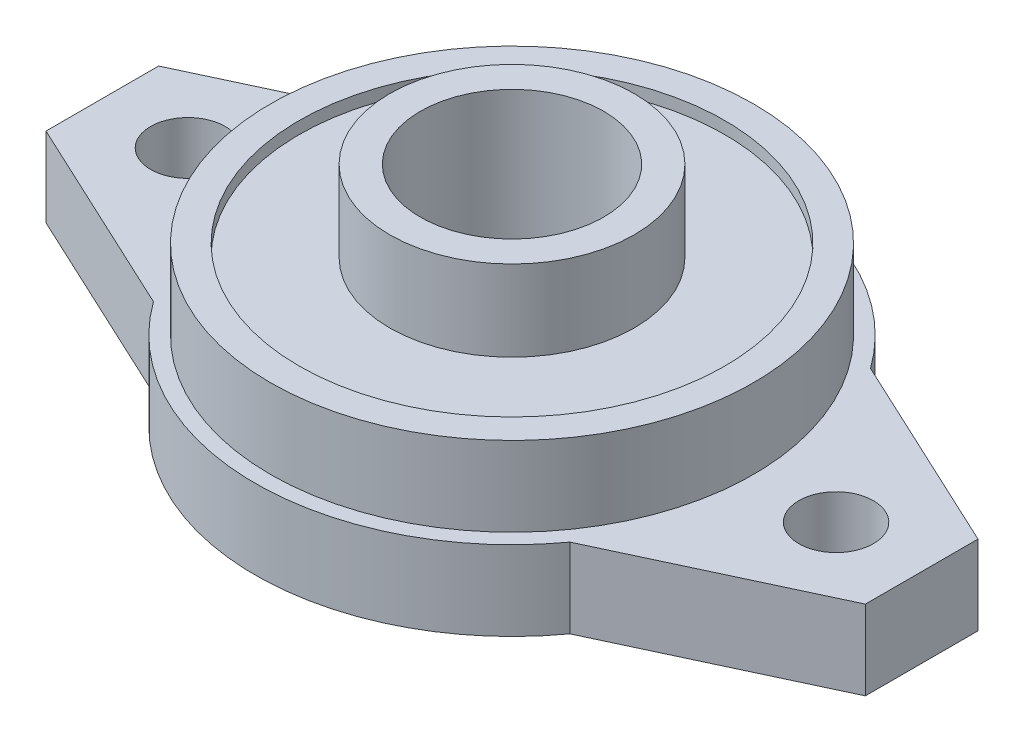
ISO-10303-21;
HEADER;
FILE_DESCRIPTION(('STEP AP214'),'2;1');
FILE_NAME('part.step','',(''),(''),'','','');
FILE_SCHEMA(('AUTOMOTIVE_DESIGN { 1 0 10303 214 1 1 1 1 }'));
ENDSEC;
DATA;
#1=APPLICATION_CONTEXT('core data for automotive mechanical design processes');
#2=APPLICATION_PROTOCOL_DEFINITION('international standard','automotive_design',2000,#1);
#3=PRODUCT_CONTEXT('',#1,'mechanical');
#4=PRODUCT('Part','Part','',(#3));
#5=PRODUCT_RELATED_PRODUCT_CATEGORY('part','',(#4));
#6=PRODUCT_DEFINITION_FORMATION('','',#4);
#7=PRODUCT_DEFINITION_CONTEXT('part definition',#1,'design');
#8=PRODUCT_DEFINITION('design','',#6,#7);
#9=PRODUCT_DEFINITION_SHAPE('','',#8);
#10=(LENGTH_UNIT() NAMED_UNIT(*) SI_UNIT(.MILLI.,.METRE.));
#11=(NAMED_UNIT(*) PLANE_ANGLE_UNIT() SI_UNIT($,.RADIAN.));
#12=(NAMED_UNIT(*) SI_UNIT($,.STERADIAN.) SOLID_ANGLE_UNIT());
#13=UNCERTAINTY_MEASURE_WITH_UNIT(LENGTH_MEASURE(1.E-05),#10,'distance_accuracy_value','');
#14=(GEOMETRIC_REPRESENTATION_CONTEXT(3) GLOBAL_UNCERTAINTY_ASSIGNED_CONTEXT((#13)) GLOBAL_UNIT_ASSIGNED_CONTEXT((#10,
#11,#12)) REPRESENTATION_CONTEXT('',''));
#15=CARTESIAN_POINT('',(0.,0.,0.));
#16=DIRECTION('',(0.,0.,1.));
#17=DIRECTION('',(1.,0.,0.));
#18=AXIS2_PLACEMENT_3D('',#15,#16,#17);
#19=CARTESIAN_POINT('',(0.,13.,0.));
#20=DIRECTION('',(0.,1.,0.));
#21=DIRECTION('',(0.,0.,1.));
#22=AXIS2_PLACEMENT_3D('',#19,#20,#21);
#23=PLANE('',#22);
#24=CARTESIAN_POINT('',(0.,13.,0.));
#25=DIRECTION('',(0.,1.,0.));
#26=DIRECTION('',(0.,0.,1.));
#27=AXIS2_PLACEMENT_3D('',#24,#25,#26);
#28=CIRCLE('',#27,17.4);
#29=CARTESIAN_POINT('',(0.,13.,17.4));
#30=VERTEX_POINT('',#29);
#31=EDGE_CURVE('E209',#30,#30,#28,.T.);
#32=ORIENTED_EDGE('',*,*,#31,.F.);
#33=EDGE_LOOP('',(#32));
#34=FACE_BOUND('',#33,.T.);
#35=CARTESIAN_POINT('',(0.,13.,0.));
#36=DIRECTION('',(0.,1.,0.));
#37=DIRECTION('',(0.,0.,1.));
#38=AXIS2_PLACEMENT_3D('',#35,#36,#37);
#39=CIRCLE('',#38,19.75);
#40=CARTESIAN_POINT('',(0.,13.,-19.75));
#41=VERTEX_POINT('',#40);
#42=EDGE_CURVE('E143',#41,#41,#39,.T.);
#43=ORIENTED_EDGE('',*,*,#42,.T.);
#44=EDGE_LOOP('',(#43));
#45=FACE_BOUND('',#44,.T.);
#46=ADVANCED_FACE('F37',(#34,#45),#23,.T.);
#47=CARTESIAN_POINT('',(0.,6.5,0.));
#48=DIRECTION('',(0.,1.,0.));
#49=DIRECTION('',(0.,0.,1.));
#50=AXIS2_PLACEMENT_3D('',#47,#48,#49);
#51=PLANE('',#50);
#52=CARTESIAN_POINT('',(26.5,6.5,0.));
#53=DIRECTION('',(0.,1.,0.));
#54=DIRECTION('',(0.,0.,1.));
#55=AXIS2_PLACEMENT_3D('',#52,#53,#54);
#56=CIRCLE('',#55,3.05);
#57=CARTESIAN_POINT('',(26.5,6.5,-3.05));
#58=VERTEX_POINT('',#57);
#59=EDGE_CURVE('E131',#58,#58,#56,.F.);
#60=ORIENTED_EDGE('',*,*,#59,.T.);
#61=EDGE_LOOP('',(#60));
#62=FACE_BOUND('',#61,.T.);
#63=DIRECTION('',(0.906176690026417,0.,0.422899286417898));
#64=VECTOR('',#63,1.);
#65=CARTESIAN_POINT('',(-7.75598540368265,6.5,16.6193072599729));
#66=LINE('',#65,#64);
#67=CARTESIAN_POINT('',(-33.5,6.5,4.60495561956913));
#68=VERTEX_POINT('',#67);
#69=CARTESIAN_POINT('',(-17.025748483338,6.5,12.2932456488153));
#70=VERTEX_POINT('',#69);
#71=EDGE_CURVE('E192',#68,#70,#66,.T.);
#72=ORIENTED_EDGE('',*,*,#71,.T.);
#73=CARTESIAN_POINT('',(0.,6.5,0.));
#74=DIRECTION('',(0.,1.,0.));
#75=DIRECTION('',(0.,0.,1.));
#76=AXIS2_PLACEMENT_3D('',#73,#74,#75);
#77=CIRCLE('',#76,21.);
#78=CARTESIAN_POINT('',(17.025748483338,6.5,12.2932456488153));
#79=VERTEX_POINT('',#78);
#80=EDGE_CURVE('E93',#70,#79,#77,.T.);
#81=ORIENTED_EDGE('',*,*,#80,.T.);
#82=DIRECTION('',(-0.906176690026417,0.,0.422899286417898));
#83=VECTOR('',#82,1.);
#84=CARTESIAN_POINT('',(7.75598540368265,6.5,16.6193072599729));
#85=LINE('',#84,#83);
#86=CARTESIAN_POINT('',(33.5,6.5,4.60495561956913));
#87=VERTEX_POINT('',#86);
#88=EDGE_CURVE('E178',#87,#79,#85,.T.);
#89=ORIENTED_EDGE('',*,*,#88,.F.);
#90=DIRECTION('',(0.,0.,1.));
#91=VECTOR('',#90,1.);
#92=CARTESIAN_POINT('',(33.5,6.5,0.));
#93=LINE('',#92,#91);
#94=CARTESIAN_POINT('',(33.5,6.5,-4.60495561956913));
#95=VERTEX_POINT('',#94);
#96=EDGE_CURVE('E190',#95,#87,#93,.T.);
#97=ORIENTED_EDGE('',*,*,#96,.F.);
#98=DIRECTION('',(-0.906176690026417,0.,-0.422899286417899));
#99=VECTOR('',#98,1.);
#100=CARTESIAN_POINT('',(7.75598540368266,6.5,-16.6193072599729));
#101=LINE('',#100,#99);
#102=CARTESIAN_POINT('',(17.025748483338,6.5,-12.2932456488153));
#103=VERTEX_POINT('',#102);
#104=EDGE_CURVE('E114',#95,#103,#101,.T.);
#105=ORIENTED_EDGE('',*,*,#104,.T.);
#106=CARTESIAN_POINT('',(-17.025748483338,6.5,-12.2932456488153));
#107=VERTEX_POINT('',#106);
#108=EDGE_CURVE('E106',#103,#107,#77,.T.);
#109=ORIENTED_EDGE('',*,*,#108,.T.);
#110=DIRECTION('',(0.906176690026417,0.,-0.422899286417899));
#111=VECTOR('',#110,1.);
#112=CARTESIAN_POINT('',(-7.75598540368266,6.5,-16.6193072599729));
#113=LINE('',#112,#111);
#114=CARTESIAN_POINT('',(-33.5,6.5,-4.60495561956913));
#115=VERTEX_POINT('',#114);
#116=EDGE_CURVE('E111',#115,#107,#113,.T.);
#117=ORIENTED_EDGE('',*,*,#116,.F.);
#118=DIRECTION('',(0.,0.,1.));
#119=VECTOR('',#118,1.);
#120=CARTESIAN_POINT('',(-33.5,6.5,0.));
#121=LINE('',#120,#119);
#122=EDGE_CURVE('E54',#115,#68,#121,.T.);
#123=ORIENTED_EDGE('',*,*,#122,.T.);
#124=EDGE_LOOP('',(#72,#81,#89,#97,#105,#109,#117,#123));
#125=FACE_BOUND('',#124,.T.);
#126=CARTESIAN_POINT('',(-26.5,6.5,0.));
#127=DIRECTION('',(0.,1.,0.));
#128=DIRECTION('',(0.,0.,1.));
#129=AXIS2_PLACEMENT_3D('',#126,#127,#128);
#130=CIRCLE('',#129,3.05);
#131=CARTESIAN_POINT('',(-26.5,6.5,-3.05));
#132=VERTEX_POINT('',#131);
#133=EDGE_CURVE('E166',#132,#132,#130,.T.);
#134=ORIENTED_EDGE('',*,*,#133,.F.);
#135=EDGE_LOOP('',(#134));
#136=FACE_BOUND('',#135,.T.);
#137=CARTESIAN_POINT('',(0.,6.5,0.));
#138=DIRECTION('',(0.,1.,0.));
#139=DIRECTION('',(0.,0.,1.));
#140=AXIS2_PLACEMENT_3D('',#137,#138,#139);
#141=CIRCLE('',#140,19.75);
#142=CARTESIAN_POINT('',(0.,6.5,-19.75));
#143=VERTEX_POINT('',#142);
#144=EDGE_CURVE('E197',#143,#143,#141,.T.);
#145=ORIENTED_EDGE('',*,*,#144,.F.);
#146=EDGE_LOOP('',(#145));
#147=FACE_BOUND('',#146,.T.);
#148=ADVANCED_FACE('F108',(#62,#125,#136,#147),#51,.T.);
#149=CARTESIAN_POINT('',(-7.75598540368265,6.5,16.6193072599729));
#150=DIRECTION('',(0.422899286417898,0.,-0.906176690026417));
#151=DIRECTION('',(-0.906176690026417,0.,-0.422899286417898));
#152=AXIS2_PLACEMENT_3D('',#149,#150,#151);
#153=PLANE('',#152);
#154=DIRECTION('',(0.906176690026417,0.,0.422899286417898));
#155=VECTOR('',#154,1.);
#156=CARTESIAN_POINT('',(-7.75598540368265,0.,16.6193072599729));
#157=LINE('',#156,#155);
#158=CARTESIAN_POINT('',(-33.5,0.,4.60495561956913));
#159=VERTEX_POINT('',#158);
#160=CARTESIAN_POINT('',(-17.025748483338,0.,12.2932456488153));
#161=VERTEX_POINT('',#160);
#162=EDGE_CURVE('E142',#159,#161,#157,.T.);
#163=ORIENTED_EDGE('',*,*,#162,.T.);
#164=DIRECTION('',(0.,-1.,0.));
#165=VECTOR('',#164,1.);
#166=CARTESIAN_POINT('',(-17.025748483338,6.5,12.2932456488153));
#167=LINE('',#166,#165);
#168=EDGE_CURVE('E11',#70,#161,#167,.T.);
#169=ORIENTED_EDGE('',*,*,#168,.F.);
#170=ORIENTED_EDGE('',*,*,#71,.F.);
#171=DIRECTION('',(0.,-1.,0.));
#172=VECTOR('',#171,1.);
#173=CARTESIAN_POINT('',(-33.5,6.5,4.60495561956913));
#174=LINE('',#173,#172);
#175=EDGE_CURVE('E138',#68,#159,#174,.T.);
#176=ORIENTED_EDGE('',*,*,#175,.T.);
#177=EDGE_LOOP('',(#163,#169,#170,#176));
#178=FACE_BOUND('',#177,.T.);
#179=ADVANCED_FACE('F245',(#178),#153,.F.);
#180=CARTESIAN_POINT('',(0.,6.5,0.));
#181=DIRECTION('',(0.,-1.,0.));
#182=DIRECTION('',(0.,0.,-1.));
#183=AXIS2_PLACEMENT_3D('',#180,#181,#182);
#184=CYLINDRICAL_SURFACE('',#183,21.);
#185=CARTESIAN_POINT('',(0.,0.,0.));
#186=DIRECTION('',(0.,1.,0.));
#187=DIRECTION('',(0.,0.,1.));
#188=AXIS2_PLACEMENT_3D('',#185,#186,#187);
#189=CIRCLE('',#188,21.);
#190=CARTESIAN_POINT('',(17.025748483338,0.,12.2932456488153));
#191=VERTEX_POINT('',#190);
#192=EDGE_CURVE('E146',#161,#191,#189,.T.);
#193=ORIENTED_EDGE('',*,*,#192,.T.);
#194=DIRECTION('',(0.,-1.,0.));
#195=VECTOR('',#194,1.);
#196=CARTESIAN_POINT('',(17.025748483338,6.5,12.2932456488153));
#197=LINE('',#196,#195);
#198=EDGE_CURVE('E46',#79,#191,#197,.T.);
#199=ORIENTED_EDGE('',*,*,#198,.F.);
#200=ORIENTED_EDGE('',*,*,#80,.F.);
#201=ORIENTED_EDGE('',*,*,#168,.T.);
#202=EDGE_LOOP('',(#193,#199,#200,#201));
#203=FACE_BOUND('',#202,.T.);
#204=ADVANCED_FACE('F179',(#203),#184,.T.);
#205=CARTESIAN_POINT('',(7.75598540368265,6.5,16.6193072599729));
#206=DIRECTION('',(0.422899286417898,0.,0.906176690026417));
#207=DIRECTION('',(0.906176690026417,0.,-0.422899286417898));
#208=AXIS2_PLACEMENT_3D('',#205,#206,#207);
#209=PLANE('',#208);
#210=DIRECTION('',(-0.906176690026417,0.,0.422899286417898));
#211=VECTOR('',#210,1.);
#212=CARTESIAN_POINT('',(7.75598540368265,0.,16.6193072599729));
#213=LINE('',#212,#211);
#214=CARTESIAN_POINT('',(33.5,0.,4.60495561956913));
#215=VERTEX_POINT('',#214);
#216=EDGE_CURVE('E149',#215,#191,#213,.T.);
#217=ORIENTED_EDGE('',*,*,#216,.F.);
#218=DIRECTION('',(0.,-1.,0.));
#219=VECTOR('',#218,1.);
#220=CARTESIAN_POINT('',(33.5,6.5,4.60495561956913));
#221=LINE('',#220,#219);
#222=EDGE_CURVE('E172',#87,#215,#221,.T.);
#223=ORIENTED_EDGE('',*,*,#222,.F.);
#224=ORIENTED_EDGE('',*,*,#88,.T.);
#225=ORIENTED_EDGE('',*,*,#198,.T.);
#226=EDGE_LOOP('',(#217,#223,#224,#225));
#227=FACE_BOUND('',#226,.T.);
#228=ADVANCED_FACE('F176',(#227),#209,.T.);
#229=CARTESIAN_POINT('',(33.5,6.5,0.));
#230=DIRECTION('',(1.,0.,0.));
#231=DIRECTION('',(0.,0.,-1.));
#232=AXIS2_PLACEMENT_3D('',#229,#230,#231);
#233=PLANE('',#232);
#234=DIRECTION('',(0.,0.,1.));
#235=VECTOR('',#234,1.);
#236=CARTESIAN_POINT('',(33.5,0.,0.));
#237=LINE('',#236,#235);
#238=CARTESIAN_POINT('',(33.5,0.,-4.60495561956913));
#239=VERTEX_POINT('',#238);
#240=EDGE_CURVE('E152',#239,#215,#237,.T.);
#241=ORIENTED_EDGE('',*,*,#240,.F.);
#242=DIRECTION('',(0.,-1.,0.));
#243=VECTOR('',#242,1.);
#244=CARTESIAN_POINT('',(33.5,6.5,-4.60495561956913));
#245=LINE('',#244,#243);
#246=EDGE_CURVE('E170',#95,#239,#245,.T.);
#247=ORIENTED_EDGE('',*,*,#246,.F.);
#248=ORIENTED_EDGE('',*,*,#96,.T.);
#249=ORIENTED_EDGE('',*,*,#222,.T.);
#250=EDGE_LOOP('',(#241,#247,#248,#249));
#251=FACE_BOUND('',#250,.T.);
#252=ADVANCED_FACE('F188',(#251),#233,.T.);
#253=CARTESIAN_POINT('',(7.75598540368266,6.5,-16.6193072599729));
#254=DIRECTION('',(-0.422899286417899,0.,0.906176690026417));
#255=DIRECTION('',(0.906176690026417,0.,0.422899286417899));
#256=AXIS2_PLACEMENT_3D('',#253,#254,#255);
#257=PLANE('',#256);
#258=DIRECTION('',(-0.906176690026417,0.,-0.422899286417899));
#259=VECTOR('',#258,1.);
#260=CARTESIAN_POINT('',(7.75598540368266,0.,-16.6193072599729));
#261=LINE('',#260,#259);
#262=CARTESIAN_POINT('',(17.025748483338,0.,-12.2932456488153));
#263=VERTEX_POINT('',#262);
#264=EDGE_CURVE('E155',#239,#263,#261,.T.);
#265=ORIENTED_EDGE('',*,*,#264,.T.);
#266=DIRECTION('',(0.,-1.,0.));
#267=VECTOR('',#266,1.);
#268=CARTESIAN_POINT('',(17.025748483338,6.5,-12.2932456488153));
#269=LINE('',#268,#267);
#270=EDGE_CURVE('E127',#103,#263,#269,.T.);
#271=ORIENTED_EDGE('',*,*,#270,.F.);
#272=ORIENTED_EDGE('',*,*,#104,.F.);
#273=ORIENTED_EDGE('',*,*,#246,.T.);
#274=EDGE_LOOP('',(#265,#271,#272,#273));
#275=FACE_BOUND('',#274,.T.);
#276=ADVANCED_FACE('F271',(#275),#257,.F.);
#277=CARTESIAN_POINT('',(-17.025748483338,0.,-12.2932456488153));
#278=VERTEX_POINT('',#277);
#279=EDGE_CURVE('E123',#263,#278,#189,.T.);
#280=ORIENTED_EDGE('',*,*,#279,.T.);
#281=DIRECTION('',(0.,-1.,0.));
#282=VECTOR('',#281,1.);
#283=CARTESIAN_POINT('',(-17.025748483338,6.5,-12.2932456488153));
#284=LINE('',#283,#282);
#285=EDGE_CURVE('E120',#107,#278,#284,.T.);
#286=ORIENTED_EDGE('',*,*,#285,.F.);
#287=ORIENTED_EDGE('',*,*,#108,.F.);
#288=ORIENTED_EDGE('',*,*,#270,.T.);
#289=EDGE_LOOP('',(#280,#286,#287,#288));
#290=FACE_BOUND('',#289,.T.);
#291=ADVANCED_FACE('F121',(#290),#184,.T.);
#292=CARTESIAN_POINT('',(-7.75598540368266,6.5,-16.6193072599729));
#293=DIRECTION('',(-0.422899286417899,0.,-0.906176690026417));
#294=DIRECTION('',(-0.906176690026417,0.,0.422899286417899));
#295=AXIS2_PLACEMENT_3D('',#292,#293,#294);
#296=PLANE('',#295);
#297=DIRECTION('',(0.906176690026417,0.,-0.422899286417899));
#298=VECTOR('',#297,1.);
#299=CARTESIAN_POINT('',(-7.75598540368266,0.,-16.6193072599729));
#300=LINE('',#299,#298);
#301=CARTESIAN_POINT('',(-33.5,0.,-4.60495561956913));
#302=VERTEX_POINT('',#301);
#303=EDGE_CURVE('E157',#302,#278,#300,.T.);
#304=ORIENTED_EDGE('',*,*,#303,.F.);
#305=DIRECTION('',(0.,-1.,0.));
#306=VECTOR('',#305,1.);
#307=CARTESIAN_POINT('',(-33.5,6.5,-4.60495561956913));
#308=LINE('',#307,#306);
#309=EDGE_CURVE('E82',#115,#302,#308,.T.);
#310=ORIENTED_EDGE('',*,*,#309,.F.);
#311=ORIENTED_EDGE('',*,*,#116,.T.);
#312=ORIENTED_EDGE('',*,*,#285,.T.);
#313=EDGE_LOOP('',(#304,#310,#311,#312));
#314=FACE_BOUND('',#313,.T.);
#315=ADVANCED_FACE('F129',(#314),#296,.T.);
#316=CARTESIAN_POINT('',(0.,6.5,0.));
#317=DIRECTION('',(0.,-1.,0.));
#318=DIRECTION('',(0.,0.,-1.));
#319=AXIS2_PLACEMENT_3D('',#316,#317,#318);
#320=CYLINDRICAL_SURFACE('',#319,7.5);
#321=CARTESIAN_POINT('',(0.,0.,0.));
#322=DIRECTION('',(0.,1.,0.));
#323=DIRECTION('',(0.,0.,1.));
#324=AXIS2_PLACEMENT_3D('',#321,#322,#323);
#325=CIRCLE('',#324,7.5);
#326=CARTESIAN_POINT('',(0.,0.,-7.5));
#327=VERTEX_POINT('',#326);
#328=EDGE_CURVE('E160',#327,#327,#325,.T.);
#329=CARTESIAN_POINT('',(0.,18.6,0.));
#330=DIRECTION('',(0.,1.,0.));
#331=DIRECTION('',(0.,0.,1.));
#332=AXIS2_PLACEMENT_3D('',#329,#330,#331);
#333=CIRCLE('',#332,7.5);
#334=CARTESIAN_POINT('',(0.,18.6,-7.5));
#335=VERTEX_POINT('',#334);
#336=EDGE_CURVE('E205',#335,#335,#333,.T.);
#337=CARTESIAN_POINT('',(0.,0.,-7.5));
#338=CARTESIAN_POINT('',(0.,0.19375,-7.5));
#339=CARTESIAN_POINT('',(0.,0.3875,-7.5));
#340=CARTESIAN_POINT('',(0.,0.775,-7.5));
#341=CARTESIAN_POINT('',(0.,0.96875,-7.5));
#342=CARTESIAN_POINT('',(0.,1.35625,-7.5));
#343=CARTESIAN_POINT('',(0.,1.55,-7.5));
#344=CARTESIAN_POINT('',(0.,1.9375,-7.5));
#345=CARTESIAN_POINT('',(0.,2.13125,-7.5));
#346=CARTESIAN_POINT('',(0.,2.51875,-7.5));
#347=CARTESIAN_POINT('',(0.,2.7125,-7.5));
#348=CARTESIAN_POINT('',(0.,3.1,-7.5));
#349=CARTESIAN_POINT('',(0.,3.29375,-7.5));
#350=CARTESIAN_POINT('',(0.,3.68125,-7.5));
#351=CARTESIAN_POINT('',(0.,3.875,-7.5));
#352=CARTESIAN_POINT('',(0.,4.2625,-7.5));
#353=CARTESIAN_POINT('',(0.,4.45625,-7.5));
#354=CARTESIAN_POINT('',(0.,4.84375,-7.5));
#355=CARTESIAN_POINT('',(0.,5.0375,-7.5));
#356=CARTESIAN_POINT('',(0.,5.425,-7.5));
#357=CARTESIAN_POINT('',(0.,5.61875,-7.5));
#358=CARTESIAN_POINT('',(0.,6.00625,-7.5));
#359=CARTESIAN_POINT('',(0.,6.2,-7.5));
#360=CARTESIAN_POINT('',(0.,6.5875,-7.5));
#361=CARTESIAN_POINT('',(0.,6.78125,-7.5));
#362=CARTESIAN_POINT('',(0.,7.16875,-7.5));
#363=CARTESIAN_POINT('',(0.,7.3625,-7.5));
#364=CARTESIAN_POINT('',(0.,7.75,-7.5));
#365=CARTESIAN_POINT('',(0.,7.94375,-7.5));
#366=CARTESIAN_POINT('',(0.,8.33125,-7.5));
#367=CARTESIAN_POINT('',(0.,8.525,-7.5));
#368=CARTESIAN_POINT('',(0.,8.9125,-7.5));
#369=CARTESIAN_POINT('',(0.,9.10625,-7.5));
#370=CARTESIAN_POINT('',(0.,9.49375,-7.5));
#371=CARTESIAN_POINT('',(0.,9.6875,-7.5));
#372=CARTESIAN_POINT('',(0.,10.075,-7.5));
#373=CARTESIAN_POINT('',(0.,10.26875,-7.5));
#374=CARTESIAN_POINT('',(0.,10.65625,-7.5));
#375=CARTESIAN_POINT('',(0.,10.85,-7.5));
#376=CARTESIAN_POINT('',(0.,11.2375,-7.5));
#377=CARTESIAN_POINT('',(0.,11.43125,-7.5));
#378=CARTESIAN_POINT('',(0.,11.81875,-7.5));
#379=CARTESIAN_POINT('',(0.,12.0125,-7.5));
#380=CARTESIAN_POINT('',(0.,12.4,-7.5));
#381=CARTESIAN_POINT('',(0.,12.59375,-7.5));
#382=CARTESIAN_POINT('',(0.,12.98125,-7.5));
#383=CARTESIAN_POINT('',(0.,13.175,-7.5));
#384=CARTESIAN_POINT('',(0.,13.5625,-7.5));
#385=CARTESIAN_POINT('',(0.,13.75625,-7.5));
#386=CARTESIAN_POINT('',(0.,14.14375,-7.5));
#387=CARTESIAN_POINT('',(0.,14.3375,-7.5));
#388=CARTESIAN_POINT('',(0.,14.725,-7.5));
#389=CARTESIAN_POINT('',(0.,14.91875,-7.5));
#390=CARTESIAN_POINT('',(0.,15.30625,-7.5));
#391=CARTESIAN_POINT('',(0.,15.5,-7.5));
#392=CARTESIAN_POINT('',(0.,15.8875,-7.5));
#393=CARTESIAN_POINT('',(0.,16.08125,-7.5));
#394=CARTESIAN_POINT('',(0.,16.46875,-7.5));
#395=CARTESIAN_POINT('',(0.,16.6625,-7.5));
#396=CARTESIAN_POINT('',(0.,17.05,-7.5));
#397=CARTESIAN_POINT('',(0.,17.24375,-7.5));
#398=CARTESIAN_POINT('',(0.,17.63125,-7.5));
#399=CARTESIAN_POINT('',(0.,17.825,-7.5));
#400=CARTESIAN_POINT('',(0.,18.2125,-7.5));
#401=CARTESIAN_POINT('',(0.,18.40625,-7.5));
#402=CARTESIAN_POINT('',(0.,18.6,-7.5));
#403=B_SPLINE_CURVE_WITH_KNOTS('',3,(#337,#338,#339,#340,#341,#342,#343,#344,#345,#346,#347,
#348,#349,#350,#351,#352,#353,#354,#355,#356,#357,#358,#359,#360,#361,#362,#363,#364,#365,#366,
#367,#368,#369,#370,#371,#372,#373,#374,#375,#376,#377,#378,#379,#380,#381,#382,#383,#384,#385,
#386,#387,#388,#389,#390,#391,#392,#393,#394,#395,#396,#397,#398,#399,#400,#401,#402),
.UNSPECIFIED.,.F.,.F.,(4,2,2,2,2,2,2,2,2,2,2,2,2,2,2,2,2,2,2,2,2,2,2,2,2,2,2,2,2,2,2,2,4),(0.,
0.58125,1.1625,1.74375,2.325,2.90625,3.4875,4.06875,4.65,5.23125,5.8125,6.39375,6.975,7.55625,
8.1375,8.71875,9.3,9.88125,10.4625,11.04375,11.625,12.20625,12.7875,13.36875,13.95,14.53125,
15.1125,15.69375,16.275,16.85625,17.4375,18.01875,18.6),.UNSPECIFIED.);
#404=EDGE_CURVE('BSEAM260',#327,#335,#403,.T.);
#405=ORIENTED_EDGE('',*,*,#328,.F.);
#406=ORIENTED_EDGE('',*,*,#336,.T.);
#407=ORIENTED_EDGE('',*,*,#404,.T.);
#408=ORIENTED_EDGE('',*,*,#404,.F.);
#409=EDGE_LOOP('',(#405,#407,#406,#408));
#410=FACE_BOUND('',#409,.T.);
#411=ADVANCED_FACE('F260',(#410),#320,.F.);
#412=CARTESIAN_POINT('',(-33.5,6.5,0.));
#413=DIRECTION('',(1.,0.,0.));
#414=DIRECTION('',(0.,0.,-1.));
#415=AXIS2_PLACEMENT_3D('',#412,#413,#414);
#416=PLANE('',#415);
#417=DIRECTION('',(0.,0.,1.));
#418=VECTOR('',#417,1.);
#419=CARTESIAN_POINT('',(-33.5,0.,0.));
#420=LINE('',#419,#418);
#421=EDGE_CURVE('E85',#302,#159,#420,.T.);
#422=ORIENTED_EDGE('',*,*,#421,.T.);
#423=ORIENTED_EDGE('',*,*,#175,.F.);
#424=ORIENTED_EDGE('',*,*,#122,.F.);
#425=ORIENTED_EDGE('',*,*,#309,.T.);
#426=EDGE_LOOP('',(#422,#423,#424,#425));
#427=FACE_BOUND('',#426,.T.);
#428=ADVANCED_FACE('F263',(#427),#416,.F.);
#429=CARTESIAN_POINT('',(-26.5,6.5,0.));
#430=DIRECTION('',(0.,-1.,0.));
#431=DIRECTION('',(0.,0.,-1.));
#432=AXIS2_PLACEMENT_3D('',#429,#430,#431);
#433=CYLINDRICAL_SURFACE('',#432,3.05);
#434=CARTESIAN_POINT('',(-26.5,0.,0.));
#435=DIRECTION('',(0.,1.,0.));
#436=DIRECTION('',(0.,0.,1.));
#437=AXIS2_PLACEMENT_3D('',#434,#435,#436);
#438=CIRCLE('',#437,3.05);
#439=CARTESIAN_POINT('',(-26.5,0.,-3.05));
#440=VERTEX_POINT('',#439);
#441=EDGE_CURVE('E139',#440,#440,#438,.T.);
#442=CARTESIAN_POINT('',(-26.5,6.5,-3.05));
#443=CARTESIAN_POINT('',(-26.5,6.43229166666667,-3.05));
#444=CARTESIAN_POINT('',(-26.5,6.36458333333333,-3.05));
#445=CARTESIAN_POINT('',(-26.5,6.22916666666667,-3.05));
#446=CARTESIAN_POINT('',(-26.5,6.16145833333333,-3.05));
#447=CARTESIAN_POINT('',(-26.5,6.02604166666667,-3.05));
#448=CARTESIAN_POINT('',(-26.5,5.95833333333333,-3.05));
#449=CARTESIAN_POINT('',(-26.5,5.82291666666667,-3.05));
#450=CARTESIAN_POINT('',(-26.5,5.75520833333333,-3.05));
#451=CARTESIAN_POINT('',(-26.5,5.61979166666667,-3.05));
#452=CARTESIAN_POINT('',(-26.5,5.55208333333333,-3.05));
#453=CARTESIAN_POINT('',(-26.5,5.41666666666667,-3.05));
#454=CARTESIAN_POINT('',(-26.5,5.34895833333333,-3.05));
#455=CARTESIAN_POINT('',(-26.5,5.21354166666667,-3.05));
#456=CARTESIAN_POINT('',(-26.5,5.14583333333333,-3.05));
#457=CARTESIAN_POINT('',(-26.5,5.01041666666667,-3.05));
#458=CARTESIAN_POINT('',(-26.5,4.94270833333333,-3.05));
#459=CARTESIAN_POINT('',(-26.5,4.80729166666667,-3.05));
#460=CARTESIAN_POINT('',(-26.5,4.73958333333333,-3.05));
#461=CARTESIAN_POINT('',(-26.5,4.60416666666667,-3.05));
#462=CARTESIAN_POINT('',(-26.5,4.53645833333333,-3.05));
#463=CARTESIAN_POINT('',(-26.5,4.40104166666667,-3.05));
#464=CARTESIAN_POINT('',(-26.5,4.33333333333333,-3.05));
#465=CARTESIAN_POINT('',(-26.5,4.19791666666667,-3.05));
#466=CARTESIAN_POINT('',(-26.5,4.13020833333333,-3.05));
#467=CARTESIAN_POINT('',(-26.5,3.99479166666667,-3.05));
#468=CARTESIAN_POINT('',(-26.5,3.92708333333333,-3.05));
#469=CARTESIAN_POINT('',(-26.5,3.79166666666667,-3.05));
#470=CARTESIAN_POINT('',(-26.5,3.72395833333333,-3.05));
#471=CARTESIAN_POINT('',(-26.5,3.58854166666667,-3.05));
#472=CARTESIAN_POINT('',(-26.5,3.52083333333333,-3.05));
#473=CARTESIAN_POINT('',(-26.5,3.38541666666667,-3.05));
#474=CARTESIAN_POINT('',(-26.5,3.31770833333333,-3.05));
#475=CARTESIAN_POINT('',(-26.5,3.18229166666667,-3.05));
#476=CARTESIAN_POINT('',(-26.5,3.11458333333333,-3.05));
#477=CARTESIAN_POINT('',(-26.5,2.97916666666667,-3.05));
#478=CARTESIAN_POINT('',(-26.5,2.91145833333333,-3.05));
#479=CARTESIAN_POINT('',(-26.5,2.77604166666667,-3.05));
#480=CARTESIAN_POINT('',(-26.5,2.70833333333333,-3.05));
#481=CARTESIAN_POINT('',(-26.5,2.57291666666667,-3.05));
#482=CARTESIAN_POINT('',(-26.5,2.50520833333333,-3.05));
#483=CARTESIAN_POINT('',(-26.5,2.36979166666667,-3.05));
#484=CARTESIAN_POINT('',(-26.5,2.30208333333333,-3.05));
#485=CARTESIAN_POINT('',(-26.5,2.16666666666667,-3.05));
#486=CARTESIAN_POINT('',(-26.5,2.09895833333333,-3.05));
#487=CARTESIAN_POINT('',(-26.5,1.96354166666667,-3.05));
#488=CARTESIAN_POINT('',(-26.5,1.89583333333333,-3.05));
#489=CARTESIAN_POINT('',(-26.5,1.76041666666667,-3.05));
#490=CARTESIAN_POINT('',(-26.5,1.69270833333333,-3.05));
#491=CARTESIAN_POINT('',(-26.5,1.55729166666667,-3.05));
#492=CARTESIAN_POINT('',(-26.5,1.48958333333333,-3.05));
#493=CARTESIAN_POINT('',(-26.5,1.35416666666667,-3.05));
#494=CARTESIAN_POINT('',(-26.5,1.28645833333333,-3.05));
#495=CARTESIAN_POINT('',(-26.5,1.15104166666667,-3.05));
#496=CARTESIAN_POINT('',(-26.5,1.08333333333333,-3.05));
#497=CARTESIAN_POINT('',(-26.5,0.947916666666667,-3.05));
#498=CARTESIAN_POINT('',(-26.5,0.880208333333333,-3.05));
#499=CARTESIAN_POINT('',(-26.5,0.744791666666667,-3.05));
#500=CARTESIAN_POINT('',(-26.5,0.677083333333333,-3.05));
#501=CARTESIAN_POINT('',(-26.5,0.541666666666667,-3.05));
#502=CARTESIAN_POINT('',(-26.5,0.473958333333333,-3.05));
#503=CARTESIAN_POINT('',(-26.5,0.338541666666667,-3.05));
#504=CARTESIAN_POINT('',(-26.5,0.270833333333334,-3.05));
#505=CARTESIAN_POINT('',(-26.5,0.135416666666667,-3.05));
#506=CARTESIAN_POINT('',(-26.5,0.0677083333333334,-3.05));
#507=CARTESIAN_POINT('',(-26.5,0.,-3.05));
#508=B_SPLINE_CURVE_WITH_KNOTS('',3,(#442,#443,#444,#445,#446,#447,#448,#449,#450,#451,#452,
#453,#454,#455,#456,#457,#458,#459,#460,#461,#462,#463,#464,#465,#466,#467,#468,#469,#470,#471,
#472,#473,#474,#475,#476,#477,#478,#479,#480,#481,#482,#483,#484,#485,#486,#487,#488,#489,#490,
#491,#492,#493,#494,#495,#496,#497,#498,#499,#500,#501,#502,#503,#504,#505,#506,#507),
.UNSPECIFIED.,.F.,.F.,(4,2,2,2,2,2,2,2,2,2,2,2,2,2,2,2,2,2,2,2,2,2,2,2,2,2,2,2,2,2,2,2,4),(0.,
0.203125,0.40625,0.609375000000001,0.812500000000001,1.015625,1.21875,1.421875,1.625,1.828125,
2.03125,2.234375,2.4375,2.640625,2.84375,3.046875,3.25,3.453125,3.65625,3.859375,4.0625,
4.265625,4.46875,4.671875,4.875,5.078125,5.28125,5.484375,5.6875,5.890625,6.09375,6.296875,6.5),.UNSPECIFIED.);
#509=EDGE_CURVE('BSEAM39',#132,#440,#508,.T.);
#510=ORIENTED_EDGE('',*,*,#133,.T.);
#511=ORIENTED_EDGE('',*,*,#441,.F.);
#512=ORIENTED_EDGE('',*,*,#509,.T.);
#513=ORIENTED_EDGE('',*,*,#509,.F.);
#514=EDGE_LOOP('',(#510,#512,#511,#513));
#515=FACE_BOUND('',#514,.T.);
#516=ADVANCED_FACE('F39',(#515),#433,.F.);
#517=CARTESIAN_POINT('',(26.5,6.5,0.));
#518=DIRECTION('',(0.,-1.,0.));
#519=DIRECTION('',(0.,0.,-1.));
#520=AXIS2_PLACEMENT_3D('',#517,#518,#519);
#521=CYLINDRICAL_SURFACE('',#520,3.05);
#522=CARTESIAN_POINT('',(26.5,0.,0.));
#523=DIRECTION('',(0.,1.,0.));
#524=DIRECTION('',(0.,0.,1.));
#525=AXIS2_PLACEMENT_3D('',#522,#523,#524);
#526=CIRCLE('',#525,3.05);
#527=CARTESIAN_POINT('',(26.5,0.,-3.05));
#528=VERTEX_POINT('',#527);
#529=EDGE_CURVE('E163',#528,#528,#526,.F.);
#530=CARTESIAN_POINT('',(26.5,6.5,-3.05));
#531=CARTESIAN_POINT('',(26.5,6.43229166666667,-3.05));
#532=CARTESIAN_POINT('',(26.5,6.36458333333333,-3.05));
#533=CARTESIAN_POINT('',(26.5,6.22916666666667,-3.05));
#534=CARTESIAN_POINT('',(26.5,6.16145833333333,-3.05));
#535=CARTESIAN_POINT('',(26.5,6.02604166666667,-3.05));
#536=CARTESIAN_POINT('',(26.5,5.95833333333333,-3.05));
#537=CARTESIAN_POINT('',(26.5,5.82291666666667,-3.05));
#538=CARTESIAN_POINT('',(26.5,5.75520833333333,-3.05));
#539=CARTESIAN_POINT('',(26.5,5.61979166666667,-3.05));
#540=CARTESIAN_POINT('',(26.5,5.55208333333333,-3.05));
#541=CARTESIAN_POINT('',(26.5,5.41666666666667,-3.05));
#542=CARTESIAN_POINT('',(26.5,5.34895833333333,-3.05));
#543=CARTESIAN_POINT('',(26.5,5.21354166666667,-3.05));
#544=CARTESIAN_POINT('',(26.5,5.14583333333333,-3.05));
#545=CARTESIAN_POINT('',(26.5,5.01041666666667,-3.05));
#546=CARTESIAN_POINT('',(26.5,4.94270833333333,-3.05));
#547=CARTESIAN_POINT('',(26.5,4.80729166666667,-3.05));
#548=CARTESIAN_POINT('',(26.5,4.73958333333333,-3.05));
#549=CARTESIAN_POINT('',(26.5,4.60416666666667,-3.05));
#550=CARTESIAN_POINT('',(26.5,4.53645833333333,-3.05));
#551=CARTESIAN_POINT('',(26.5,4.40104166666667,-3.05));
#552=CARTESIAN_POINT('',(26.5,4.33333333333333,-3.05));
#553=CARTESIAN_POINT('',(26.5,4.19791666666667,-3.05));
#554=CARTESIAN_POINT('',(26.5,4.13020833333333,-3.05));
#555=CARTESIAN_POINT('',(26.5,3.99479166666667,-3.05));
#556=CARTESIAN_POINT('',(26.5,3.92708333333333,-3.05));
#557=CARTESIAN_POINT('',(26.5,3.79166666666667,-3.05));
#558=CARTESIAN_POINT('',(26.5,3.72395833333333,-3.05));
#559=CARTESIAN_POINT('',(26.5,3.58854166666667,-3.05));
#560=CARTESIAN_POINT('',(26.5,3.52083333333333,-3.05));
#561=CARTESIAN_POINT('',(26.5,3.38541666666667,-3.05));
#562=CARTESIAN_POINT('',(26.5,3.31770833333333,-3.05));
#563=CARTESIAN_POINT('',(26.5,3.18229166666667,-3.05));
#564=CARTESIAN_POINT('',(26.5,3.11458333333333,-3.05));
#565=CARTESIAN_POINT('',(26.5,2.97916666666667,-3.05));
#566=CARTESIAN_POINT('',(26.5,2.91145833333333,-3.05));
#567=CARTESIAN_POINT('',(26.5,2.77604166666667,-3.05));
#568=CARTESIAN_POINT('',(26.5,2.70833333333333,-3.05));
#569=CARTESIAN_POINT('',(26.5,2.57291666666667,-3.05));
#570=CARTESIAN_POINT('',(26.5,2.50520833333333,-3.05));
#571=CARTESIAN_POINT('',(26.5,2.36979166666667,-3.05));
#572=CARTESIAN_POINT('',(26.5,2.30208333333333,-3.05));
#573=CARTESIAN_POINT('',(26.5,2.16666666666667,-3.05));
#574=CARTESIAN_POINT('',(26.5,2.09895833333333,-3.05));
#575=CARTESIAN_POINT('',(26.5,1.96354166666667,-3.05));
#576=CARTESIAN_POINT('',(26.5,1.89583333333333,-3.05));
#577=CARTESIAN_POINT('',(26.5,1.76041666666667,-3.05));
#578=CARTESIAN_POINT('',(26.5,1.69270833333333,-3.05));
#579=CARTESIAN_POINT('',(26.5,1.55729166666667,-3.05));
#580=CARTESIAN_POINT('',(26.5,1.48958333333333,-3.05));
#581=CARTESIAN_POINT('',(26.5,1.35416666666667,-3.05));
#582=CARTESIAN_POINT('',(26.5,1.28645833333333,-3.05));
#583=CARTESIAN_POINT('',(26.5,1.15104166666667,-3.05));
#584=CARTESIAN_POINT('',(26.5,1.08333333333333,-3.05));
#585=CARTESIAN_POINT('',(26.5,0.947916666666667,-3.05));
#586=CARTESIAN_POINT('',(26.5,0.880208333333333,-3.05));
#587=CARTESIAN_POINT('',(26.5,0.744791666666667,-3.05));
#588=CARTESIAN_POINT('',(26.5,0.677083333333333,-3.05));
#589=CARTESIAN_POINT('',(26.5,0.541666666666667,-3.05));
#590=CARTESIAN_POINT('',(26.5,0.473958333333333,-3.05));
#591=CARTESIAN_POINT('',(26.5,0.338541666666667,-3.05));
#592=CARTESIAN_POINT('',(26.5,0.270833333333334,-3.05));
#593=CARTESIAN_POINT('',(26.5,0.135416666666667,-3.05));
#594=CARTESIAN_POINT('',(26.5,0.0677083333333334,-3.05));
#595=CARTESIAN_POINT('',(26.5,0.,-3.05));
#596=B_SPLINE_CURVE_WITH_KNOTS('',3,(#530,#531,#532,#533,#534,#535,#536,#537,#538,#539,#540,
#541,#542,#543,#544,#545,#546,#547,#548,#549,#550,#551,#552,#553,#554,#555,#556,#557,#558,#559,
#560,#561,#562,#563,#564,#565,#566,#567,#568,#569,#570,#571,#572,#573,#574,#575,#576,#577,#578,
#579,#580,#581,#582,#583,#584,#585,#586,#587,#588,#589,#590,#591,#592,#593,#594,#595),
.UNSPECIFIED.,.F.,.F.,(4,2,2,2,2,2,2,2,2,2,2,2,2,2,2,2,2,2,2,2,2,2,2,2,2,2,2,2,2,2,2,2,4),(0.,
0.203125,0.40625,0.609375000000001,0.812500000000001,1.015625,1.21875,1.421875,1.625,1.828125,
2.03125,2.234375,2.4375,2.640625,2.84375,3.046875,3.25,3.453125,3.65625,3.859375,4.0625,
4.265625,4.46875,4.671875,4.875,5.078125,5.28125,5.484375,5.6875,5.890625,6.09375,6.296875,6.5),.UNSPECIFIED.);
#597=EDGE_CURVE('BSEAM255',#58,#528,#596,.T.);
#598=ORIENTED_EDGE('',*,*,#59,.F.);
#599=ORIENTED_EDGE('',*,*,#529,.T.);
#600=ORIENTED_EDGE('',*,*,#597,.T.);
#601=ORIENTED_EDGE('',*,*,#597,.F.);
#602=EDGE_LOOP('',(#598,#600,#599,#601));
#603=FACE_BOUND('',#602,.T.);
#604=ADVANCED_FACE('F255',(#603),#521,.F.);
#605=CARTESIAN_POINT('',(0.,0.,0.));
#606=DIRECTION('',(0.,1.,0.));
#607=DIRECTION('',(0.,0.,1.));
#608=AXIS2_PLACEMENT_3D('',#605,#606,#607);
#609=PLANE('',#608);
#610=ORIENTED_EDGE('',*,*,#441,.T.);
#611=EDGE_LOOP('',(#610));
#612=FACE_BOUND('',#611,.T.);
#613=ORIENTED_EDGE('',*,*,#162,.F.);
#614=ORIENTED_EDGE('',*,*,#421,.F.);
#615=ORIENTED_EDGE('',*,*,#303,.T.);
#616=ORIENTED_EDGE('',*,*,#279,.F.);
#617=ORIENTED_EDGE('',*,*,#264,.F.);
#618=ORIENTED_EDGE('',*,*,#240,.T.);
#619=ORIENTED_EDGE('',*,*,#216,.T.);
#620=ORIENTED_EDGE('',*,*,#192,.F.);
#621=EDGE_LOOP('',(#613,#614,#615,#616,#617,#618,#619,#620));
#622=FACE_BOUND('',#621,.T.);
#623=ORIENTED_EDGE('',*,*,#328,.T.);
#624=EDGE_LOOP('',(#623));
#625=FACE_BOUND('',#624,.T.);
#626=ORIENTED_EDGE('',*,*,#529,.F.);
#627=EDGE_LOOP('',(#626));
#628=FACE_BOUND('',#627,.T.);
#629=ADVANCED_FACE('F183',(#612,#622,#625,#628),#609,.F.);
#630=CARTESIAN_POINT('',(0.,13.,0.));
#631=DIRECTION('',(0.,-1.,0.));
#632=DIRECTION('',(0.,0.,-1.));
#633=AXIS2_PLACEMENT_3D('',#630,#631,#632);
#634=CYLINDRICAL_SURFACE('',#633,19.75);
#635=CARTESIAN_POINT('',(0.,13.,-19.75));
#636=CARTESIAN_POINT('',(0.,12.9322916666667,-19.75));
#637=CARTESIAN_POINT('',(0.,12.8645833333333,-19.75));
#638=CARTESIAN_POINT('',(0.,12.7291666666667,-19.75));
#639=CARTESIAN_POINT('',(0.,12.6614583333333,-19.75));
#640=CARTESIAN_POINT('',(0.,12.5260416666667,-19.75));
#641=CARTESIAN_POINT('',(0.,12.4583333333333,-19.75));
#642=CARTESIAN_POINT('',(0.,12.3229166666667,-19.75));
#643=CARTESIAN_POINT('',(0.,12.2552083333333,-19.75));
#644=CARTESIAN_POINT('',(0.,12.1197916666667,-19.75));
#645=CARTESIAN_POINT('',(0.,12.0520833333333,-19.75));
#646=CARTESIAN_POINT('',(0.,11.9166666666667,-19.75));
#647=CARTESIAN_POINT('',(0.,11.8489583333333,-19.75));
#648=CARTESIAN_POINT('',(0.,11.7135416666667,-19.75));
#649=CARTESIAN_POINT('',(0.,11.6458333333333,-19.75));
#650=CARTESIAN_POINT('',(0.,11.5104166666667,-19.75));
#651=CARTESIAN_POINT('',(0.,11.4427083333333,-19.75));
#652=CARTESIAN_POINT('',(0.,11.3072916666667,-19.75));
#653=CARTESIAN_POINT('',(0.,11.2395833333333,-19.75));
#654=CARTESIAN_POINT('',(0.,11.1041666666667,-19.75));
#655=CARTESIAN_POINT('',(0.,11.0364583333333,-19.75));
#656=CARTESIAN_POINT('',(0.,10.9010416666667,-19.75));
#657=CARTESIAN_POINT('',(0.,10.8333333333333,-19.75));
#658=CARTESIAN_POINT('',(0.,10.6979166666667,-19.75));
#659=CARTESIAN_POINT('',(0.,10.6302083333333,-19.75));
#660=CARTESIAN_POINT('',(0.,10.4947916666667,-19.75));
#661=CARTESIAN_POINT('',(0.,10.4270833333333,-19.75));
#662=CARTESIAN_POINT('',(0.,10.2916666666667,-19.75));
#663=CARTESIAN_POINT('',(0.,10.2239583333333,-19.75));
#664=CARTESIAN_POINT('',(0.,10.0885416666667,-19.75));
#665=CARTESIAN_POINT('',(0.,10.0208333333333,-19.75));
#666=CARTESIAN_POINT('',(0.,9.88541666666667,-19.75));
#667=CARTESIAN_POINT('',(0.,9.81770833333333,-19.75));
#668=CARTESIAN_POINT('',(0.,9.68229166666667,-19.75));
#669=CARTESIAN_POINT('',(0.,9.61458333333333,-19.75));
#670=CARTESIAN_POINT('',(0.,9.47916666666667,-19.75));
#671=CARTESIAN_POINT('',(0.,9.41145833333333,-19.75));
#672=CARTESIAN_POINT('',(0.,9.27604166666667,-19.75));
#673=CARTESIAN_POINT('',(0.,9.20833333333333,-19.75));
#674=CARTESIAN_POINT('',(0.,9.07291666666667,-19.75));
#675=CARTESIAN_POINT('',(0.,9.00520833333333,-19.75));
#676=CARTESIAN_POINT('',(0.,8.86979166666667,-19.75));
#677=CARTESIAN_POINT('',(0.,8.80208333333333,-19.75));
#678=CARTESIAN_POINT('',(0.,8.66666666666667,-19.75));
#679=CARTESIAN_POINT('',(0.,8.59895833333333,-19.75));
#680=CARTESIAN_POINT('',(0.,8.46354166666667,-19.75));
#681=CARTESIAN_POINT('',(0.,8.39583333333333,-19.75));
#682=CARTESIAN_POINT('',(0.,8.26041666666667,-19.75));
#683=CARTESIAN_POINT('',(0.,8.19270833333333,-19.75));
#684=CARTESIAN_POINT('',(0.,8.05729166666667,-19.75));
#685=CARTESIAN_POINT('',(0.,7.98958333333333,-19.75));
#686=CARTESIAN_POINT('',(0.,7.85416666666667,-19.75));
#687=CARTESIAN_POINT('',(0.,7.78645833333333,-19.75));
#688=CARTESIAN_POINT('',(0.,7.65104166666667,-19.75));
#689=CARTESIAN_POINT('',(0.,7.58333333333333,-19.75));
#690=CARTESIAN_POINT('',(0.,7.44791666666667,-19.75));
#691=CARTESIAN_POINT('',(0.,7.38020833333333,-19.75));
#692=CARTESIAN_POINT('',(0.,7.24479166666667,-19.75));
#693=CARTESIAN_POINT('',(0.,7.17708333333333,-19.75));
#694=CARTESIAN_POINT('',(0.,7.04166666666667,-19.75));
#695=CARTESIAN_POINT('',(0.,6.97395833333333,-19.75));
#696=CARTESIAN_POINT('',(0.,6.83854166666667,-19.75));
#697=CARTESIAN_POINT('',(0.,6.77083333333333,-19.75));
#698=CARTESIAN_POINT('',(0.,6.63541666666667,-19.75));
#699=CARTESIAN_POINT('',(0.,6.56770833333333,-19.75));
#700=CARTESIAN_POINT('',(0.,6.5,-19.75));
#701=B_SPLINE_CURVE_WITH_KNOTS('',3,(#635,#636,#637,#638,#639,#640,#641,#642,#643,#644,#645,
#646,#647,#648,#649,#650,#651,#652,#653,#654,#655,#656,#657,#658,#659,#660,#661,#662,#663,#664,
#665,#666,#667,#668,#669,#670,#671,#672,#673,#674,#675,#676,#677,#678,#679,#680,#681,#682,#683,
#684,#685,#686,#687,#688,#689,#690,#691,#692,#693,#694,#695,#696,#697,#698,#699,#700),
.UNSPECIFIED.,.F.,.F.,(4,2,2,2,2,2,2,2,2,2,2,2,2,2,2,2,2,2,2,2,2,2,2,2,2,2,2,2,2,2,2,2,4),(0.,
0.203125,0.40625,0.609375000000001,0.812500000000001,1.015625,1.21875,1.421875,1.625,1.828125,
2.03125,2.234375,2.4375,2.640625,2.84375,3.046875,3.25,3.453125,3.65625,3.859375,4.0625,
4.265625,4.46875,4.671875,4.875,5.078125,5.28125,5.484375,5.6875,5.890625,6.09375,6.296875,6.5),.UNSPECIFIED.);
#702=EDGE_CURVE('BSEAM237',#41,#143,#701,.T.);
#703=ORIENTED_EDGE('',*,*,#42,.F.);
#704=ORIENTED_EDGE('',*,*,#144,.T.);
#705=ORIENTED_EDGE('',*,*,#702,.T.);
#706=ORIENTED_EDGE('',*,*,#702,.F.);
#707=EDGE_LOOP('',(#703,#705,#704,#706));
#708=FACE_BOUND('',#707,.T.);
#709=ADVANCED_FACE('F237',(#708),#634,.T.);
#710=CARTESIAN_POINT('',(0.,18.6,0.));
#711=DIRECTION('',(0.,1.,0.));
#712=DIRECTION('',(0.,0.,1.));
#713=AXIS2_PLACEMENT_3D('',#710,#711,#712);
#714=PLANE('',#713);
#715=CARTESIAN_POINT('',(0.,18.6,0.));
#716=DIRECTION('',(0.,1.,0.));
#717=DIRECTION('',(0.,0.,1.));
#718=AXIS2_PLACEMENT_3D('',#715,#716,#717);
#719=CIRCLE('',#718,10.);
#720=CARTESIAN_POINT('',(0.,18.6,10.));
#721=VERTEX_POINT('',#720);
#722=EDGE_CURVE('E200',#721,#721,#719,.T.);
#723=ORIENTED_EDGE('',*,*,#722,.T.);
#724=EDGE_LOOP('',(#723));
#725=FACE_BOUND('',#724,.T.);
#726=ORIENTED_EDGE('',*,*,#336,.F.);
#727=EDGE_LOOP('',(#726));
#728=FACE_BOUND('',#727,.T.);
#729=ADVANCED_FACE('F240',(#725,#728),#714,.T.);
#730=CARTESIAN_POINT('',(0.,18.6,0.));
#731=DIRECTION('',(0.,-1.,0.));
#732=DIRECTION('',(0.,0.,-1.));
#733=AXIS2_PLACEMENT_3D('',#730,#731,#732);
#734=CYLINDRICAL_SURFACE('',#733,10.);
#735=ORIENTED_EDGE('',*,*,#722,.F.);
#736=EDGE_LOOP('',(#735));
#737=FACE_BOUND('',#736,.T.);
#738=CARTESIAN_POINT('',(0.,12.,0.));
#739=DIRECTION('',(0.,1.,0.));
#740=DIRECTION('',(0.,0.,1.));
#741=AXIS2_PLACEMENT_3D('',#738,#739,#740);
#742=CIRCLE('',#741,10.);
#743=CARTESIAN_POINT('',(0.,12.,10.));
#744=VERTEX_POINT('',#743);
#745=EDGE_CURVE('E212',#744,#744,#742,.T.);
#746=ORIENTED_EDGE('',*,*,#745,.T.);
#747=EDGE_LOOP('',(#746));
#748=FACE_BOUND('',#747,.T.);
#749=ADVANCED_FACE('F218',(#737,#748),#734,.T.);
#750=CARTESIAN_POINT('',(0.,12.,0.));
#751=DIRECTION('',(0.,1.,0.));
#752=DIRECTION('',(0.,0.,1.));
#753=AXIS2_PLACEMENT_3D('',#750,#751,#752);
#754=CYLINDRICAL_SURFACE('',#753,17.4);
#755=CARTESIAN_POINT('',(0.,12.,0.));
#756=DIRECTION('',(0.,1.,0.));
#757=DIRECTION('',(0.,0.,1.));
#758=AXIS2_PLACEMENT_3D('',#755,#756,#757);
#759=CIRCLE('',#758,17.4);
#760=CARTESIAN_POINT('',(0.,12.,17.4));
#761=VERTEX_POINT('',#760);
#762=EDGE_CURVE('E208',#761,#761,#759,.T.);
#763=ORIENTED_EDGE('',*,*,#762,.F.);
#764=EDGE_LOOP('',(#763));
#765=FACE_BOUND('',#764,.T.);
#766=ORIENTED_EDGE('',*,*,#31,.T.);
#767=EDGE_LOOP('',(#766));
#768=FACE_BOUND('',#767,.T.);
#769=ADVANCED_FACE('F223',(#765,#768),#754,.F.);
#770=CARTESIAN_POINT('',(0.,12.,0.));
#771=DIRECTION('',(0.,1.,0.));
#772=DIRECTION('',(0.,0.,1.));
#773=AXIS2_PLACEMENT_3D('',#770,#771,#772);
#774=PLANE('',#773);
#775=ORIENTED_EDGE('',*,*,#745,.F.);
#776=EDGE_LOOP('',(#775));
#777=FACE_BOUND('',#776,.T.);
#778=ORIENTED_EDGE('',*,*,#762,.T.);
#779=EDGE_LOOP('',(#778));
#780=FACE_BOUND('',#779,.T.);
#781=ADVANCED_FACE('F220',(#777,#780),#774,.T.);
#782=CLOSED_SHELL('',(#46,#148,#179,#204,#228,#252,#276,#291,#315,#411,#428,#516,#604,#629,#709,
#729,#749,#769,#781));
#783=MANIFOLD_SOLID_BREP('B2',#782);
#784=ADVANCED_BREP_SHAPE_REPRESENTATION('',(#18,#783),#14);
#785=SHAPE_DEFINITION_REPRESENTATION(#9,#784);
ENDSEC;
END-ISO-10303-21;
